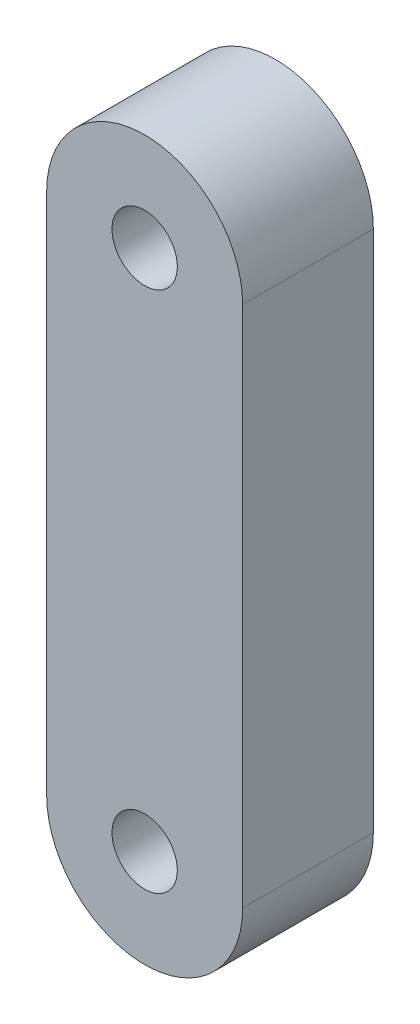
ISO-10303-21;
HEADER;
FILE_DESCRIPTION(('STEP AP214'),'2;1');
FILE_NAME('part.step','',(''),(''),'','','');
FILE_SCHEMA(('AUTOMOTIVE_DESIGN { 1 0 10303 214 1 1 1 1 }'));
ENDSEC;
DATA;
#1=APPLICATION_CONTEXT('core data for automotive mechanical design processes');
#2=APPLICATION_PROTOCOL_DEFINITION('international standard','automotive_design',2000,#1);
#3=PRODUCT_CONTEXT('',#1,'mechanical');
#4=PRODUCT('Part','Part','',(#3));
#5=PRODUCT_RELATED_PRODUCT_CATEGORY('part','',(#4));
#6=PRODUCT_DEFINITION_FORMATION('','',#4);
#7=PRODUCT_DEFINITION_CONTEXT('part definition',#1,'design');
#8=PRODUCT_DEFINITION('design','',#6,#7);
#9=PRODUCT_DEFINITION_SHAPE('','',#8);
#10=(LENGTH_UNIT() NAMED_UNIT(*) SI_UNIT(.MILLI.,.METRE.));
#11=(NAMED_UNIT(*) PLANE_ANGLE_UNIT() SI_UNIT($,.RADIAN.));
#12=(NAMED_UNIT(*) SI_UNIT($,.STERADIAN.) SOLID_ANGLE_UNIT());
#13=UNCERTAINTY_MEASURE_WITH_UNIT(LENGTH_MEASURE(1.E-05),#10,'distance_accuracy_value','');
#14=(GEOMETRIC_REPRESENTATION_CONTEXT(3) GLOBAL_UNCERTAINTY_ASSIGNED_CONTEXT((#13)) GLOBAL_UNIT_ASSIGNED_CONTEXT((#10,
#11,#12)) REPRESENTATION_CONTEXT('',''));
#15=CARTESIAN_POINT('',(0.,0.,0.));
#16=DIRECTION('',(0.,0.,1.));
#17=DIRECTION('',(1.,0.,0.));
#18=AXIS2_PLACEMENT_3D('',#15,#16,#17);
#19=CARTESIAN_POINT('',(-1.5,0.,2.));
#20=DIRECTION('',(1.,0.,0.));
#21=DIRECTION('',(0.,0.,-1.));
#22=AXIS2_PLACEMENT_3D('',#19,#20,#21);
#23=PLANE('',#22);
#24=DIRECTION('',(0.,-1.,0.));
#25=VECTOR('',#24,1.);
#26=CARTESIAN_POINT('',(-1.5,0.,0.));
#27=LINE('',#26,#25);
#28=CARTESIAN_POINT('',(-1.5,8.99999999999999,0.));
#29=VERTEX_POINT('',#28);
#30=CARTESIAN_POINT('',(-1.5,1.,0.));
#31=VERTEX_POINT('',#30);
#32=EDGE_CURVE('E104',#29,#31,#27,.T.);
#33=ORIENTED_EDGE('',*,*,#32,.T.);
#34=DIRECTION('',(0.,0.,-1.));
#35=VECTOR('',#34,1.);
#36=CARTESIAN_POINT('',(-1.5,1.,2.));
#37=LINE('',#36,#35);
#38=CARTESIAN_POINT('',(-1.5,1.,2.));
#39=VERTEX_POINT('',#38);
#40=EDGE_CURVE('E11',#39,#31,#37,.T.);
#41=ORIENTED_EDGE('',*,*,#40,.F.);
#42=DIRECTION('',(0.,-1.,0.));
#43=VECTOR('',#42,1.);
#44=CARTESIAN_POINT('',(-1.5,0.,2.));
#45=LINE('',#44,#43);
#46=CARTESIAN_POINT('',(-1.5,8.99999999999999,2.));
#47=VERTEX_POINT('',#46);
#48=EDGE_CURVE('E83',#47,#39,#45,.T.);
#49=ORIENTED_EDGE('',*,*,#48,.F.);
#50=DIRECTION('',(0.,0.,-1.));
#51=VECTOR('',#50,1.);
#52=CARTESIAN_POINT('',(-1.5,8.99999999999999,2.));
#53=LINE('',#52,#51);
#54=EDGE_CURVE('E94',#47,#29,#53,.T.);
#55=ORIENTED_EDGE('',*,*,#54,.T.);
#56=EDGE_LOOP('',(#33,#41,#49,#55));
#57=FACE_BOUND('',#56,.T.);
#58=ADVANCED_FACE('F35',(#57),#23,.F.);
#59=CARTESIAN_POINT('',(0.,1.,2.));
#60=DIRECTION('',(0.,0.,-1.));
#61=DIRECTION('',(-1.,0.,0.));
#62=AXIS2_PLACEMENT_3D('',#59,#60,#61);
#63=CYLINDRICAL_SURFACE('',#62,1.5);
#64=CARTESIAN_POINT('',(0.,1.,0.));
#65=DIRECTION('',(0.,0.,1.));
#66=DIRECTION('',(1.,0.,0.));
#67=AXIS2_PLACEMENT_3D('',#64,#65,#66);
#68=CIRCLE('',#67,1.5);
#69=CARTESIAN_POINT('',(1.5,1.,0.));
#70=VERTEX_POINT('',#69);
#71=EDGE_CURVE('E88',#31,#70,#68,.T.);
#72=ORIENTED_EDGE('',*,*,#71,.T.);
#73=DIRECTION('',(0.,0.,-1.));
#74=VECTOR('',#73,1.);
#75=CARTESIAN_POINT('',(1.5,1.,2.));
#76=LINE('',#75,#74);
#77=CARTESIAN_POINT('',(1.5,1.,2.));
#78=VERTEX_POINT('',#77);
#79=EDGE_CURVE('E44',#78,#70,#76,.T.);
#80=ORIENTED_EDGE('',*,*,#79,.F.);
#81=CARTESIAN_POINT('',(0.,1.,2.));
#82=DIRECTION('',(0.,0.,1.));
#83=DIRECTION('',(1.,0.,0.));
#84=AXIS2_PLACEMENT_3D('',#81,#82,#83);
#85=CIRCLE('',#84,1.5);
#86=EDGE_CURVE('E78',#39,#78,#85,.T.);
#87=ORIENTED_EDGE('',*,*,#86,.F.);
#88=ORIENTED_EDGE('',*,*,#40,.T.);
#89=EDGE_LOOP('',(#72,#80,#87,#88));
#90=FACE_BOUND('',#89,.T.);
#91=ADVANCED_FACE('F87',(#90),#63,.T.);
#92=CARTESIAN_POINT('',(1.5,0.,2.));
#93=DIRECTION('',(1.,0.,0.));
#94=DIRECTION('',(0.,0.,-1.));
#95=AXIS2_PLACEMENT_3D('',#92,#93,#94);
#96=PLANE('',#95);
#97=DIRECTION('',(0.,-1.,0.));
#98=VECTOR('',#97,1.);
#99=CARTESIAN_POINT('',(1.5,0.,0.));
#100=LINE('',#99,#98);
#101=CARTESIAN_POINT('',(1.5,8.99999999999999,0.));
#102=VERTEX_POINT('',#101);
#103=EDGE_CURVE('E108',#102,#70,#100,.T.);
#104=ORIENTED_EDGE('',*,*,#103,.F.);
#105=DIRECTION('',(0.,0.,-1.));
#106=VECTOR('',#105,1.);
#107=CARTESIAN_POINT('',(1.5,8.99999999999999,2.));
#108=LINE('',#107,#106);
#109=CARTESIAN_POINT('',(1.5,8.99999999999999,2.));
#110=VERTEX_POINT('',#109);
#111=EDGE_CURVE('E68',#110,#102,#108,.T.);
#112=ORIENTED_EDGE('',*,*,#111,.F.);
#113=DIRECTION('',(0.,-1.,0.));
#114=VECTOR('',#113,1.);
#115=CARTESIAN_POINT('',(1.5,0.,2.));
#116=LINE('',#115,#114);
#117=EDGE_CURVE('E81',#110,#78,#116,.T.);
#118=ORIENTED_EDGE('',*,*,#117,.T.);
#119=ORIENTED_EDGE('',*,*,#79,.T.);
#120=EDGE_LOOP('',(#104,#112,#118,#119));
#121=FACE_BOUND('',#120,.T.);
#122=ADVANCED_FACE('F92',(#121),#96,.T.);
#123=CARTESIAN_POINT('',(0.,8.99999999999999,2.));
#124=DIRECTION('',(0.,0.,-1.));
#125=DIRECTION('',(-1.,0.,0.));
#126=AXIS2_PLACEMENT_3D('',#123,#124,#125);
#127=CYLINDRICAL_SURFACE('',#126,0.5);
#128=CARTESIAN_POINT('',(0.,8.99999999999999,2.));
#129=DIRECTION('',(0.,0.,1.));
#130=DIRECTION('',(1.,0.,0.));
#131=AXIS2_PLACEMENT_3D('',#128,#129,#130);
#132=CIRCLE('',#131,0.5);
#133=CARTESIAN_POINT('',(0.499999999999959,8.99999999999999,2.));
#134=VERTEX_POINT('',#133);
#135=EDGE_CURVE('E146',#134,#134,#132,.T.);
#136=ORIENTED_EDGE('',*,*,#135,.T.);
#137=EDGE_LOOP('',(#136));
#138=FACE_BOUND('',#137,.T.);
#139=CARTESIAN_POINT('',(0.,8.99999999999999,0.));
#140=DIRECTION('',(0.,0.,1.));
#141=DIRECTION('',(1.,0.,0.));
#142=AXIS2_PLACEMENT_3D('',#139,#140,#141);
#143=CIRCLE('',#142,0.5);
#144=CARTESIAN_POINT('',(0.499999999999959,8.99999999999999,0.));
#145=VERTEX_POINT('',#144);
#146=EDGE_CURVE('E101',#145,#145,#143,.T.);
#147=ORIENTED_EDGE('',*,*,#146,.F.);
#148=EDGE_LOOP('',(#147));
#149=FACE_BOUND('',#148,.T.);
#150=ADVANCED_FACE('F135',(#138,#149),#127,.F.);
#151=CARTESIAN_POINT('',(0.,1.,2.));
#152=DIRECTION('',(0.,0.,-1.));
#153=DIRECTION('',(-1.,0.,0.));
#154=AXIS2_PLACEMENT_3D('',#151,#152,#153);
#155=CYLINDRICAL_SURFACE('',#154,0.5);
#156=CARTESIAN_POINT('',(0.,1.,2.));
#157=DIRECTION('',(0.,0.,1.));
#158=DIRECTION('',(1.,0.,0.));
#159=AXIS2_PLACEMENT_3D('',#156,#157,#158);
#160=CIRCLE('',#159,0.5);
#161=CARTESIAN_POINT('',(0.5,1.,2.));
#162=VERTEX_POINT('',#161);
#163=EDGE_CURVE('E111',#162,#162,#160,.T.);
#164=ORIENTED_EDGE('',*,*,#163,.T.);
#165=EDGE_LOOP('',(#164));
#166=FACE_BOUND('',#165,.T.);
#167=CARTESIAN_POINT('',(0.,1.,0.));
#168=DIRECTION('',(0.,0.,1.));
#169=DIRECTION('',(1.,0.,0.));
#170=AXIS2_PLACEMENT_3D('',#167,#168,#169);
#171=CIRCLE('',#170,0.5);
#172=CARTESIAN_POINT('',(0.5,1.,0.));
#173=VERTEX_POINT('',#172);
#174=EDGE_CURVE('E98',#173,#173,#171,.T.);
#175=ORIENTED_EDGE('',*,*,#174,.F.);
#176=EDGE_LOOP('',(#175));
#177=FACE_BOUND('',#176,.T.);
#178=ADVANCED_FACE('F37',(#166,#177),#155,.F.);
#179=CARTESIAN_POINT('',(0.,8.99999999999999,2.));
#180=DIRECTION('',(0.,0.,-1.));
#181=DIRECTION('',(-1.,0.,0.));
#182=AXIS2_PLACEMENT_3D('',#179,#180,#181);
#183=CYLINDRICAL_SURFACE('',#182,1.5);
#184=CARTESIAN_POINT('',(0.,8.99999999999999,0.));
#185=DIRECTION('',(0.,0.,1.));
#186=DIRECTION('',(1.,0.,0.));
#187=AXIS2_PLACEMENT_3D('',#184,#185,#186);
#188=CIRCLE('',#187,1.5);
#189=EDGE_CURVE('E71',#102,#29,#188,.T.);
#190=ORIENTED_EDGE('',*,*,#189,.T.);
#191=ORIENTED_EDGE('',*,*,#54,.F.);
#192=CARTESIAN_POINT('',(0.,8.99999999999999,2.));
#193=DIRECTION('',(0.,0.,1.));
#194=DIRECTION('',(1.,0.,0.));
#195=AXIS2_PLACEMENT_3D('',#192,#193,#194);
#196=CIRCLE('',#195,1.5);
#197=EDGE_CURVE('E52',#110,#47,#196,.T.);
#198=ORIENTED_EDGE('',*,*,#197,.F.);
#199=ORIENTED_EDGE('',*,*,#111,.T.);
#200=EDGE_LOOP('',(#190,#191,#198,#199));
#201=FACE_BOUND('',#200,.T.);
#202=ADVANCED_FACE('F123',(#201),#183,.T.);
#203=CARTESIAN_POINT('',(0.,0.,2.));
#204=DIRECTION('',(0.,0.,1.));
#205=DIRECTION('',(1.,0.,0.));
#206=AXIS2_PLACEMENT_3D('',#203,#204,#205);
#207=PLANE('',#206);
#208=ORIENTED_EDGE('',*,*,#163,.F.);
#209=EDGE_LOOP('',(#208));
#210=FACE_BOUND('',#209,.T.);
#211=ORIENTED_EDGE('',*,*,#135,.F.);
#212=EDGE_LOOP('',(#211));
#213=FACE_BOUND('',#212,.T.);
#214=ORIENTED_EDGE('',*,*,#48,.T.);
#215=ORIENTED_EDGE('',*,*,#86,.T.);
#216=ORIENTED_EDGE('',*,*,#117,.F.);
#217=ORIENTED_EDGE('',*,*,#197,.T.);
#218=EDGE_LOOP('',(#214,#215,#216,#217));
#219=FACE_BOUND('',#218,.T.);
#220=ADVANCED_FACE('F79',(#210,#213,#219),#207,.T.);
#221=CARTESIAN_POINT('',(0.,0.,0.));
#222=DIRECTION('',(0.,0.,1.));
#223=DIRECTION('',(1.,0.,0.));
#224=AXIS2_PLACEMENT_3D('',#221,#222,#223);
#225=PLANE('',#224);
#226=ORIENTED_EDGE('',*,*,#174,.T.);
#227=EDGE_LOOP('',(#226));
#228=FACE_BOUND('',#227,.T.);
#229=ORIENTED_EDGE('',*,*,#146,.T.);
#230=EDGE_LOOP('',(#229));
#231=FACE_BOUND('',#230,.T.);
#232=ORIENTED_EDGE('',*,*,#32,.F.);
#233=ORIENTED_EDGE('',*,*,#189,.F.);
#234=ORIENTED_EDGE('',*,*,#103,.T.);
#235=ORIENTED_EDGE('',*,*,#71,.F.);
#236=EDGE_LOOP('',(#232,#233,#234,#235));
#237=FACE_BOUND('',#236,.T.);
#238=ADVANCED_FACE('F116',(#228,#231,#237),#225,.F.);
#239=CLOSED_SHELL('',(#58,#91,#122,#150,#178,#202,#220,#238));
#240=MANIFOLD_SOLID_BREP('B2',#239);
#241=ADVANCED_BREP_SHAPE_REPRESENTATION('',(#18,#240),#14);
#242=SHAPE_DEFINITION_REPRESENTATION(#9,#241);
ENDSEC;
END-ISO-10303-21;
